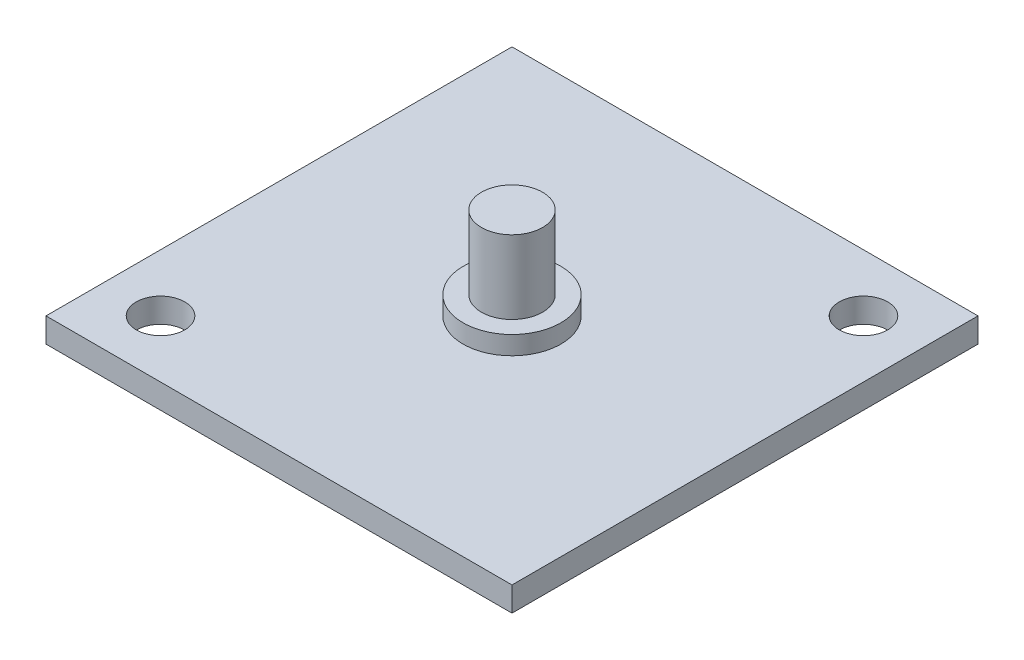
ISO-10303-21;
HEADER;
FILE_DESCRIPTION(('STEP AP214'),'2;1');
FILE_NAME('part.step','',(''),(''),'','','');
FILE_SCHEMA(('AUTOMOTIVE_DESIGN { 1 0 10303 214 1 1 1 1 }'));
ENDSEC;
DATA;
#1=APPLICATION_CONTEXT('core data for automotive mechanical design processes');
#2=APPLICATION_PROTOCOL_DEFINITION('international standard','automotive_design',2000,#1);
#3=PRODUCT_CONTEXT('',#1,'mechanical');
#4=PRODUCT('Part','Part','',(#3));
#5=PRODUCT_RELATED_PRODUCT_CATEGORY('part','',(#4));
#6=PRODUCT_DEFINITION_FORMATION('','',#4);
#7=PRODUCT_DEFINITION_CONTEXT('part definition',#1,'design');
#8=PRODUCT_DEFINITION('design','',#6,#7);
#9=PRODUCT_DEFINITION_SHAPE('','',#8);
#10=(LENGTH_UNIT() NAMED_UNIT(*) SI_UNIT(.MILLI.,.METRE.));
#11=(NAMED_UNIT(*) PLANE_ANGLE_UNIT() SI_UNIT($,.RADIAN.));
#12=(NAMED_UNIT(*) SI_UNIT($,.STERADIAN.) SOLID_ANGLE_UNIT());
#13=UNCERTAINTY_MEASURE_WITH_UNIT(LENGTH_MEASURE(1.E-05),#10,'distance_accuracy_value','');
#14=(GEOMETRIC_REPRESENTATION_CONTEXT(3) GLOBAL_UNCERTAINTY_ASSIGNED_CONTEXT((#13)) GLOBAL_UNIT_ASSIGNED_CONTEXT((#10,
#11,#12)) REPRESENTATION_CONTEXT('',''));
#15=CARTESIAN_POINT('',(0.,0.,0.));
#16=DIRECTION('',(0.,0.,1.));
#17=DIRECTION('',(1.,0.,0.));
#18=AXIS2_PLACEMENT_3D('',#15,#16,#17);
#19=CARTESIAN_POINT('',(0.,2.,0.));
#20=DIRECTION('',(0.,-1.,0.));
#21=DIRECTION('',(0.,0.,-1.));
#22=AXIS2_PLACEMENT_3D('',#19,#20,#21);
#23=PLANE('',#22);
#24=CARTESIAN_POINT('',(0.,2.,0.));
#25=DIRECTION('',(0.,-1.,0.));
#26=DIRECTION('',(0.,0.,-1.));
#27=AXIS2_PLACEMENT_3D('',#24,#25,#26);
#28=CIRCLE('',#27,4.0005);
#29=CARTESIAN_POINT('',(0.,2.,-4.0005));
#30=VERTEX_POINT('',#29);
#31=EDGE_CURVE('E11',#30,#30,#28,.F.);
#32=ORIENTED_EDGE('',*,*,#31,.F.);
#33=EDGE_LOOP('',(#32));
#34=FACE_BOUND('',#33,.T.);
#35=DIRECTION('',(0.,0.,-1.));
#36=VECTOR('',#35,1.);
#37=CARTESIAN_POINT('',(19.05,2.,19.05));
#38=LINE('',#37,#36);
#39=CARTESIAN_POINT('',(19.05,2.,19.05));
#40=VERTEX_POINT('',#39);
#41=CARTESIAN_POINT('',(19.05,2.,-19.05));
#42=VERTEX_POINT('',#41);
#43=EDGE_CURVE('E86',#40,#42,#38,.T.);
#44=ORIENTED_EDGE('',*,*,#43,.T.);
#45=DIRECTION('',(-1.,0.,0.));
#46=VECTOR('',#45,1.);
#47=CARTESIAN_POINT('',(-19.05,2.,-19.05));
#48=LINE('',#47,#46);
#49=CARTESIAN_POINT('',(-19.05,2.,-19.05));
#50=VERTEX_POINT('',#49);
#51=EDGE_CURVE('E81',#42,#50,#48,.T.);
#52=ORIENTED_EDGE('',*,*,#51,.T.);
#53=DIRECTION('',(0.,0.,1.));
#54=VECTOR('',#53,1.);
#55=CARTESIAN_POINT('',(-19.05,2.,19.05));
#56=LINE('',#55,#54);
#57=CARTESIAN_POINT('',(-19.05,2.,19.05));
#58=VERTEX_POINT('',#57);
#59=EDGE_CURVE('E84',#50,#58,#56,.T.);
#60=ORIENTED_EDGE('',*,*,#59,.T.);
#61=DIRECTION('',(1.,0.,0.));
#62=VECTOR('',#61,1.);
#63=CARTESIAN_POINT('',(-19.05,2.,19.05));
#64=LINE('',#63,#62);
#65=EDGE_CURVE('E50',#58,#40,#64,.T.);
#66=ORIENTED_EDGE('',*,*,#65,.T.);
#67=EDGE_LOOP('',(#44,#52,#60,#66));
#68=FACE_BOUND('',#67,.T.);
#69=CARTESIAN_POINT('',(14.3684097937107,2.,-14.3684097937106));
#70=DIRECTION('',(0.,1.,0.));
#71=DIRECTION('',(0.,0.,1.));
#72=AXIS2_PLACEMENT_3D('',#69,#70,#71);
#73=CIRCLE('',#72,1.984375);
#74=CARTESIAN_POINT('',(14.3684097937107,2.,-12.3840347937106));
#75=VERTEX_POINT('',#74);
#76=EDGE_CURVE('E103',#75,#75,#73,.T.);
#77=ORIENTED_EDGE('',*,*,#76,.F.);
#78=EDGE_LOOP('',(#77));
#79=FACE_BOUND('',#78,.T.);
#80=CARTESIAN_POINT('',(-14.3684097937107,2.,14.3684097937106));
#81=DIRECTION('',(0.,1.,0.));
#82=DIRECTION('',(0.,0.,-1.));
#83=AXIS2_PLACEMENT_3D('',#80,#81,#82);
#84=CIRCLE('',#83,1.984375);
#85=CARTESIAN_POINT('',(-14.3684097937107,2.,12.3840347937106));
#86=VERTEX_POINT('',#85);
#87=EDGE_CURVE('E120',#86,#86,#84,.T.);
#88=ORIENTED_EDGE('',*,*,#87,.F.);
#89=EDGE_LOOP('',(#88));
#90=FACE_BOUND('',#89,.T.);
#91=ADVANCED_FACE('F33',(#34,#68,#79,#90),#23,.F.);
#92=CARTESIAN_POINT('',(0.,0.,0.));
#93=DIRECTION('',(0.,-1.,0.));
#94=DIRECTION('',(0.,0.,-1.));
#95=AXIS2_PLACEMENT_3D('',#92,#93,#94);
#96=PLANE('',#95);
#97=CARTESIAN_POINT('',(14.3684097937107,0.,-14.3684097937106));
#98=DIRECTION('',(0.,1.,0.));
#99=DIRECTION('',(0.,0.,1.));
#100=AXIS2_PLACEMENT_3D('',#97,#98,#99);
#101=CIRCLE('',#100,1.984375);
#102=CARTESIAN_POINT('',(14.3684097937107,0.,-12.3840347937106));
#103=VERTEX_POINT('',#102);
#104=EDGE_CURVE('E124',#103,#103,#101,.T.);
#105=ORIENTED_EDGE('',*,*,#104,.T.);
#106=EDGE_LOOP('',(#105));
#107=FACE_BOUND('',#106,.T.);
#108=DIRECTION('',(0.,0.,-1.));
#109=VECTOR('',#108,1.);
#110=CARTESIAN_POINT('',(19.05,0.,19.05));
#111=LINE('',#110,#109);
#112=CARTESIAN_POINT('',(19.05,0.,19.05));
#113=VERTEX_POINT('',#112);
#114=CARTESIAN_POINT('',(19.05,0.,-19.05));
#115=VERTEX_POINT('',#114);
#116=EDGE_CURVE('E100',#113,#115,#111,.T.);
#117=ORIENTED_EDGE('',*,*,#116,.F.);
#118=DIRECTION('',(1.,0.,0.));
#119=VECTOR('',#118,1.);
#120=CARTESIAN_POINT('',(-19.05,0.,19.05));
#121=LINE('',#120,#119);
#122=CARTESIAN_POINT('',(-19.05,0.,19.05));
#123=VERTEX_POINT('',#122);
#124=EDGE_CURVE('E73',#123,#113,#121,.T.);
#125=ORIENTED_EDGE('',*,*,#124,.F.);
#126=DIRECTION('',(0.,0.,1.));
#127=VECTOR('',#126,1.);
#128=CARTESIAN_POINT('',(-19.05,0.,19.05));
#129=LINE('',#128,#127);
#130=CARTESIAN_POINT('',(-19.05,0.,-19.05));
#131=VERTEX_POINT('',#130);
#132=EDGE_CURVE('E67',#131,#123,#129,.T.);
#133=ORIENTED_EDGE('',*,*,#132,.F.);
#134=DIRECTION('',(-1.,0.,0.));
#135=VECTOR('',#134,1.);
#136=CARTESIAN_POINT('',(-19.05,0.,-19.05));
#137=LINE('',#136,#135);
#138=EDGE_CURVE('E91',#115,#131,#137,.T.);
#139=ORIENTED_EDGE('',*,*,#138,.F.);
#140=EDGE_LOOP('',(#117,#125,#133,#139));
#141=FACE_BOUND('',#140,.T.);
#142=CARTESIAN_POINT('',(-14.3684097937107,0.,14.3684097937106));
#143=DIRECTION('',(0.,1.,0.));
#144=DIRECTION('',(0.,0.,-1.));
#145=AXIS2_PLACEMENT_3D('',#142,#143,#144);
#146=CIRCLE('',#145,1.984375);
#147=CARTESIAN_POINT('',(-14.3684097937107,0.,12.3840347937106));
#148=VERTEX_POINT('',#147);
#149=EDGE_CURVE('E118',#148,#148,#146,.T.);
#150=ORIENTED_EDGE('',*,*,#149,.T.);
#151=EDGE_LOOP('',(#150));
#152=FACE_BOUND('',#151,.T.);
#153=ADVANCED_FACE('F111',(#107,#141,#152),#96,.T.);
#154=CARTESIAN_POINT('',(19.05,2.,19.05));
#155=DIRECTION('',(-1.,0.,0.));
#156=DIRECTION('',(0.,0.,1.));
#157=AXIS2_PLACEMENT_3D('',#154,#155,#156);
#158=PLANE('',#157);
#159=ORIENTED_EDGE('',*,*,#116,.T.);
#160=DIRECTION('',(0.,-1.,0.));
#161=VECTOR('',#160,1.);
#162=CARTESIAN_POINT('',(19.05,2.,-19.05));
#163=LINE('',#162,#161);
#164=EDGE_CURVE('E42',#42,#115,#163,.T.);
#165=ORIENTED_EDGE('',*,*,#164,.F.);
#166=ORIENTED_EDGE('',*,*,#43,.F.);
#167=DIRECTION('',(0.,-1.,0.));
#168=VECTOR('',#167,1.);
#169=CARTESIAN_POINT('',(19.05,2.,19.05));
#170=LINE('',#169,#168);
#171=EDGE_CURVE('E96',#40,#113,#170,.T.);
#172=ORIENTED_EDGE('',*,*,#171,.T.);
#173=EDGE_LOOP('',(#159,#165,#166,#172));
#174=FACE_BOUND('',#173,.T.);
#175=ADVANCED_FACE('F35',(#174),#158,.F.);
#176=CARTESIAN_POINT('',(-19.05,2.,-19.05));
#177=DIRECTION('',(0.,0.,1.));
#178=DIRECTION('',(1.,0.,0.));
#179=AXIS2_PLACEMENT_3D('',#176,#177,#178);
#180=PLANE('',#179);
#181=ORIENTED_EDGE('',*,*,#138,.T.);
#182=DIRECTION('',(0.,-1.,0.));
#183=VECTOR('',#182,1.);
#184=CARTESIAN_POINT('',(-19.05,2.,-19.05));
#185=LINE('',#184,#183);
#186=EDGE_CURVE('E89',#50,#131,#185,.T.);
#187=ORIENTED_EDGE('',*,*,#186,.F.);
#188=ORIENTED_EDGE('',*,*,#51,.F.);
#189=ORIENTED_EDGE('',*,*,#164,.T.);
#190=EDGE_LOOP('',(#181,#187,#188,#189));
#191=FACE_BOUND('',#190,.T.);
#192=ADVANCED_FACE('F90',(#191),#180,.F.);
#193=CARTESIAN_POINT('',(-19.05,2.,19.05));
#194=DIRECTION('',(1.,0.,0.));
#195=DIRECTION('',(0.,0.,-1.));
#196=AXIS2_PLACEMENT_3D('',#193,#194,#195);
#197=PLANE('',#196);
#198=ORIENTED_EDGE('',*,*,#132,.T.);
#199=DIRECTION('',(0.,-1.,0.));
#200=VECTOR('',#199,1.);
#201=CARTESIAN_POINT('',(-19.05,2.,19.05));
#202=LINE('',#201,#200);
#203=EDGE_CURVE('E92',#58,#123,#202,.T.);
#204=ORIENTED_EDGE('',*,*,#203,.F.);
#205=ORIENTED_EDGE('',*,*,#59,.F.);
#206=ORIENTED_EDGE('',*,*,#186,.T.);
#207=EDGE_LOOP('',(#198,#204,#205,#206));
#208=FACE_BOUND('',#207,.T.);
#209=ADVANCED_FACE('F94',(#208),#197,.F.);
#210=CARTESIAN_POINT('',(-19.05,2.,19.05));
#211=DIRECTION('',(0.,0.,-1.));
#212=DIRECTION('',(-1.,0.,0.));
#213=AXIS2_PLACEMENT_3D('',#210,#211,#212);
#214=PLANE('',#213);
#215=ORIENTED_EDGE('',*,*,#124,.T.);
#216=ORIENTED_EDGE('',*,*,#171,.F.);
#217=ORIENTED_EDGE('',*,*,#65,.F.);
#218=ORIENTED_EDGE('',*,*,#203,.T.);
#219=EDGE_LOOP('',(#215,#216,#217,#218));
#220=FACE_BOUND('',#219,.T.);
#221=ADVANCED_FACE('F138',(#220),#214,.F.);
#222=CARTESIAN_POINT('',(14.3684097937107,2.,-14.3684097937106));
#223=DIRECTION('',(0.,-1.,0.));
#224=DIRECTION('',(0.,0.,-1.));
#225=AXIS2_PLACEMENT_3D('',#222,#223,#224);
#226=CYLINDRICAL_SURFACE('',#225,1.984375);
#227=ORIENTED_EDGE('',*,*,#76,.T.);
#228=EDGE_LOOP('',(#227));
#229=FACE_BOUND('',#228,.T.);
#230=ORIENTED_EDGE('',*,*,#104,.F.);
#231=EDGE_LOOP('',(#230));
#232=FACE_BOUND('',#231,.T.);
#233=ADVANCED_FACE('F135',(#229,#232),#226,.F.);
#234=CARTESIAN_POINT('',(-14.3684097937107,2.,14.3684097937106));
#235=DIRECTION('',(0.,-1.,0.));
#236=DIRECTION('',(0.,0.,-1.));
#237=AXIS2_PLACEMENT_3D('',#234,#235,#236);
#238=CYLINDRICAL_SURFACE('',#237,1.984375);
#239=ORIENTED_EDGE('',*,*,#87,.T.);
#240=EDGE_LOOP('',(#239));
#241=FACE_BOUND('',#240,.T.);
#242=ORIENTED_EDGE('',*,*,#149,.F.);
#243=EDGE_LOOP('',(#242));
#244=FACE_BOUND('',#243,.T.);
#245=ADVANCED_FACE('F137',(#241,#244),#238,.F.);
#246=CARTESIAN_POINT('',(0.,3.508000032,0.));
#247=DIRECTION('',(0.,-1.,0.));
#248=DIRECTION('',(0.,0.,-1.));
#249=AXIS2_PLACEMENT_3D('',#246,#247,#248);
#250=CYLINDRICAL_SURFACE('',#249,4.0005);
#251=CARTESIAN_POINT('',(0.,3.508000032,0.));
#252=DIRECTION('',(0.,1.,0.));
#253=DIRECTION('',(0.,0.,1.));
#254=AXIS2_PLACEMENT_3D('',#251,#252,#253);
#255=CIRCLE('',#254,4.0005);
#256=CARTESIAN_POINT('',(0.,3.508000032,-4.0005));
#257=VERTEX_POINT('',#256);
#258=EDGE_CURVE('E121',#257,#257,#255,.T.);
#259=CARTESIAN_POINT('',(0.,3.508000032,-4.0005));
#260=CARTESIAN_POINT('',(0.,3.49229169833333,-4.0005));
#261=CARTESIAN_POINT('',(0.,3.47658336466667,-4.0005));
#262=CARTESIAN_POINT('',(0.,3.44516669733333,-4.0005));
#263=CARTESIAN_POINT('',(0.,3.42945836366667,-4.0005));
#264=CARTESIAN_POINT('',(0.,3.39804169633333,-4.0005));
#265=CARTESIAN_POINT('',(0.,3.38233336266667,-4.0005));
#266=CARTESIAN_POINT('',(0.,3.35091669533333,-4.0005));
#267=CARTESIAN_POINT('',(0.,3.33520836166667,-4.0005));
#268=CARTESIAN_POINT('',(0.,3.30379169433333,-4.0005));
#269=CARTESIAN_POINT('',(0.,3.28808336066667,-4.0005));
#270=CARTESIAN_POINT('',(0.,3.25666669333333,-4.0005));
#271=CARTESIAN_POINT('',(0.,3.24095835966667,-4.0005));
#272=CARTESIAN_POINT('',(0.,3.20954169233333,-4.0005));
#273=CARTESIAN_POINT('',(0.,3.19383335866667,-4.0005));
#274=CARTESIAN_POINT('',(0.,3.16241669133333,-4.0005));
#275=CARTESIAN_POINT('',(0.,3.14670835766667,-4.0005));
#276=CARTESIAN_POINT('',(0.,3.11529169033333,-4.0005));
#277=CARTESIAN_POINT('',(0.,3.09958335666667,-4.0005));
#278=CARTESIAN_POINT('',(0.,3.06816668933333,-4.0005));
#279=CARTESIAN_POINT('',(0.,3.05245835566667,-4.0005));
#280=CARTESIAN_POINT('',(0.,3.02104168833333,-4.0005));
#281=CARTESIAN_POINT('',(0.,3.00533335466667,-4.0005));
#282=CARTESIAN_POINT('',(0.,2.97391668733333,-4.0005));
#283=CARTESIAN_POINT('',(0.,2.95820835366667,-4.0005));
#284=CARTESIAN_POINT('',(0.,2.92679168633333,-4.0005));
#285=CARTESIAN_POINT('',(0.,2.91108335266667,-4.0005));
#286=CARTESIAN_POINT('',(0.,2.87966668533333,-4.0005));
#287=CARTESIAN_POINT('',(0.,2.86395835166667,-4.0005));
#288=CARTESIAN_POINT('',(0.,2.83254168433333,-4.0005));
#289=CARTESIAN_POINT('',(0.,2.81683335066667,-4.0005));
#290=CARTESIAN_POINT('',(0.,2.78541668333333,-4.0005));
#291=CARTESIAN_POINT('',(0.,2.76970834966667,-4.0005));
#292=CARTESIAN_POINT('',(0.,2.73829168233333,-4.0005));
#293=CARTESIAN_POINT('',(0.,2.72258334866667,-4.0005));
#294=CARTESIAN_POINT('',(0.,2.69116668133333,-4.0005));
#295=CARTESIAN_POINT('',(0.,2.67545834766667,-4.0005));
#296=CARTESIAN_POINT('',(0.,2.64404168033333,-4.0005));
#297=CARTESIAN_POINT('',(0.,2.62833334666667,-4.0005));
#298=CARTESIAN_POINT('',(0.,2.59691667933333,-4.0005));
#299=CARTESIAN_POINT('',(0.,2.58120834566667,-4.0005));
#300=CARTESIAN_POINT('',(0.,2.54979167833333,-4.0005));
#301=CARTESIAN_POINT('',(0.,2.53408334466667,-4.0005));
#302=CARTESIAN_POINT('',(0.,2.50266667733333,-4.0005));
#303=CARTESIAN_POINT('',(0.,2.48695834366667,-4.0005));
#304=CARTESIAN_POINT('',(0.,2.45554167633333,-4.0005));
#305=CARTESIAN_POINT('',(0.,2.43983334266667,-4.0005));
#306=CARTESIAN_POINT('',(0.,2.40841667533333,-4.0005));
#307=CARTESIAN_POINT('',(0.,2.39270834166667,-4.0005));
#308=CARTESIAN_POINT('',(0.,2.36129167433333,-4.0005));
#309=CARTESIAN_POINT('',(0.,2.34558334066667,-4.0005));
#310=CARTESIAN_POINT('',(0.,2.31416667333333,-4.0005));
#311=CARTESIAN_POINT('',(0.,2.29845833966667,-4.0005));
#312=CARTESIAN_POINT('',(0.,2.26704167233333,-4.0005));
#313=CARTESIAN_POINT('',(0.,2.25133333866667,-4.0005));
#314=CARTESIAN_POINT('',(0.,2.21991667133333,-4.0005));
#315=CARTESIAN_POINT('',(0.,2.20420833766667,-4.0005));
#316=CARTESIAN_POINT('',(0.,2.17279167033333,-4.0005));
#317=CARTESIAN_POINT('',(0.,2.15708333666667,-4.0005));
#318=CARTESIAN_POINT('',(0.,2.12566666933333,-4.0005));
#319=CARTESIAN_POINT('',(0.,2.10995833566667,-4.0005));
#320=CARTESIAN_POINT('',(0.,2.07854166833333,-4.0005));
#321=CARTESIAN_POINT('',(0.,2.06283333466667,-4.0005));
#322=CARTESIAN_POINT('',(0.,2.03141666733333,-4.0005));
#323=CARTESIAN_POINT('',(0.,2.01570833366667,-4.0005));
#324=CARTESIAN_POINT('',(0.,2.,-4.0005));
#325=B_SPLINE_CURVE_WITH_KNOTS('',3,(#259,#260,#261,#262,#263,#264,#265,#266,#267,#268,#269,
#270,#271,#272,#273,#274,#275,#276,#277,#278,#279,#280,#281,#282,#283,#284,#285,#286,#287,#288,
#289,#290,#291,#292,#293,#294,#295,#296,#297,#298,#299,#300,#301,#302,#303,#304,#305,#306,#307,
#308,#309,#310,#311,#312,#313,#314,#315,#316,#317,#318,#319,#320,#321,#322,#323,#324),
.UNSPECIFIED.,.F.,.F.,(4,2,2,2,2,2,2,2,2,2,2,2,2,2,2,2,2,2,2,2,2,2,2,2,2,2,2,2,2,2,2,2,4),(0.,
0.0471250009999999,0.0942500019999997,0.141375003,0.188500004,0.235625005,0.282750006,
0.329875007,0.377000008,0.424125009,0.47125001,0.518375011,0.565500012,0.612625013,0.659750014,
0.706875014999999,0.754000015999999,0.801125017,0.848250018,0.895375019,0.94250002,
0.989625020999999,1.036750022,1.083875023,1.131000024,1.178125025,1.225250026,1.272375027,
1.319500028,1.366625029,1.41375003,1.460875031,1.508000032),.UNSPECIFIED.);
#326=EDGE_CURVE('BSEAM145',#257,#30,#325,.T.);
#327=ORIENTED_EDGE('',*,*,#258,.F.);
#328=ORIENTED_EDGE('',*,*,#31,.T.);
#329=ORIENTED_EDGE('',*,*,#326,.T.);
#330=ORIENTED_EDGE('',*,*,#326,.F.);
#331=EDGE_LOOP('',(#327,#329,#328,#330));
#332=FACE_BOUND('',#331,.T.);
#333=ADVANCED_FACE('F145',(#332),#250,.T.);
#334=CARTESIAN_POINT('',(0.,3.508000032,0.));
#335=DIRECTION('',(0.,1.,0.));
#336=DIRECTION('',(0.,0.,1.));
#337=AXIS2_PLACEMENT_3D('',#334,#335,#336);
#338=PLANE('',#337);
#339=CARTESIAN_POINT('',(0.,3.508000032,0.));
#340=DIRECTION('',(0.,1.,0.));
#341=DIRECTION('',(0.,0.,1.));
#342=AXIS2_PLACEMENT_3D('',#339,#340,#341);
#343=CIRCLE('',#342,2.5);
#344=CARTESIAN_POINT('',(0.,3.508000032,2.5));
#345=VERTEX_POINT('',#344);
#346=EDGE_CURVE('E241',#345,#345,#343,.T.);
#347=ORIENTED_EDGE('',*,*,#346,.F.);
#348=EDGE_LOOP('',(#347));
#349=FACE_BOUND('',#348,.T.);
#350=ORIENTED_EDGE('',*,*,#258,.T.);
#351=EDGE_LOOP('',(#350));
#352=FACE_BOUND('',#351,.T.);
#353=ADVANCED_FACE('F205',(#349,#352),#338,.T.);
#354=CARTESIAN_POINT('',(0.,9.508000032,0.));
#355=DIRECTION('',(0.,-1.,0.));
#356=DIRECTION('',(0.,0.,-1.));
#357=AXIS2_PLACEMENT_3D('',#354,#355,#356);
#358=CYLINDRICAL_SURFACE('',#357,2.5);
#359=CARTESIAN_POINT('',(0.,9.508000032,0.));
#360=DIRECTION('',(0.,1.,0.));
#361=DIRECTION('',(0.,0.,1.));
#362=AXIS2_PLACEMENT_3D('',#359,#360,#361);
#363=CIRCLE('',#362,2.5);
#364=CARTESIAN_POINT('',(0.,9.508000032,2.5));
#365=VERTEX_POINT('',#364);
#366=EDGE_CURVE('E127',#365,#365,#363,.T.);
#367=ORIENTED_EDGE('',*,*,#366,.F.);
#368=EDGE_LOOP('',(#367));
#369=FACE_BOUND('',#368,.T.);
#370=ORIENTED_EDGE('',*,*,#346,.T.);
#371=EDGE_LOOP('',(#370));
#372=FACE_BOUND('',#371,.T.);
#373=ADVANCED_FACE('F214',(#369,#372),#358,.T.);
#374=CARTESIAN_POINT('',(0.,9.508000032,0.));
#375=DIRECTION('',(0.,1.,0.));
#376=DIRECTION('',(0.,0.,1.));
#377=AXIS2_PLACEMENT_3D('',#374,#375,#376);
#378=PLANE('',#377);
#379=ORIENTED_EDGE('',*,*,#366,.T.);
#380=EDGE_LOOP('',(#379));
#381=FACE_BOUND('',#380,.T.);
#382=ADVANCED_FACE('F223',(#381),#378,.T.);
#383=CLOSED_SHELL('',(#91,#153,#175,#192,#209,#221,#233,#245,#333,#353,#373,#382));
#384=MANIFOLD_SOLID_BREP('B2',#383);
#385=ADVANCED_BREP_SHAPE_REPRESENTATION('',(#18,#384),#14);
#386=SHAPE_DEFINITION_REPRESENTATION(#9,#385);
ENDSEC;
END-ISO-10303-21;
